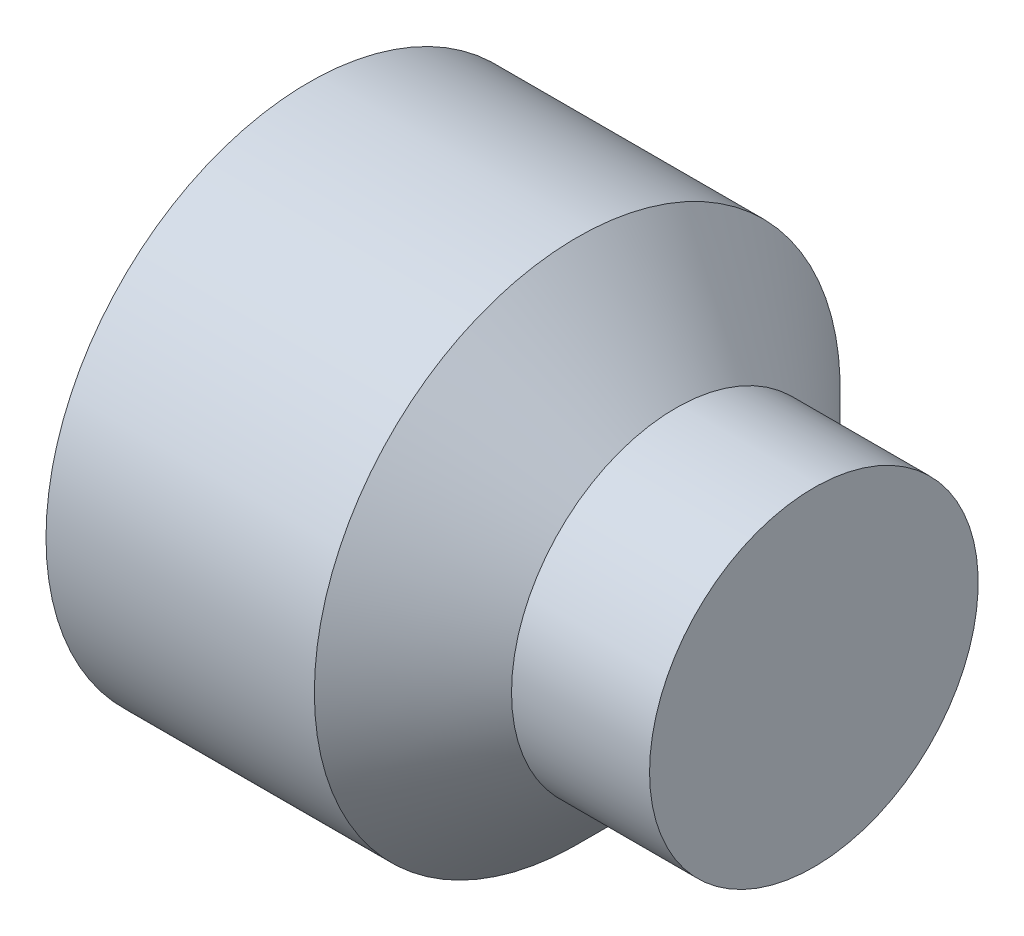
ISO-10303-21;
HEADER;
FILE_DESCRIPTION(('STEP AP214'),'2;1');
FILE_NAME('part.step','',(''),(''),'','','');
FILE_SCHEMA(('AUTOMOTIVE_DESIGN { 1 0 10303 214 1 1 1 1 }'));
ENDSEC;
DATA;
#1=APPLICATION_CONTEXT('core data for automotive mechanical design processes');
#2=APPLICATION_PROTOCOL_DEFINITION('international standard','automotive_design',2000,#1);
#3=PRODUCT_CONTEXT('',#1,'mechanical');
#4=PRODUCT('Part','Part','',(#3));
#5=PRODUCT_RELATED_PRODUCT_CATEGORY('part','',(#4));
#6=PRODUCT_DEFINITION_FORMATION('','',#4);
#7=PRODUCT_DEFINITION_CONTEXT('part definition',#1,'design');
#8=PRODUCT_DEFINITION('design','',#6,#7);
#9=PRODUCT_DEFINITION_SHAPE('','',#8);
#10=(LENGTH_UNIT() NAMED_UNIT(*) SI_UNIT(.MILLI.,.METRE.));
#11=(NAMED_UNIT(*) PLANE_ANGLE_UNIT() SI_UNIT($,.RADIAN.));
#12=(NAMED_UNIT(*) SI_UNIT($,.STERADIAN.) SOLID_ANGLE_UNIT());
#13=UNCERTAINTY_MEASURE_WITH_UNIT(LENGTH_MEASURE(1.E-05),#10,'distance_accuracy_value','');
#14=(GEOMETRIC_REPRESENTATION_CONTEXT(3) GLOBAL_UNCERTAINTY_ASSIGNED_CONTEXT((#13)) GLOBAL_UNIT_ASSIGNED_CONTEXT((#10,
#11,#12)) REPRESENTATION_CONTEXT('',''));
#15=CARTESIAN_POINT('',(0.,0.,0.));
#16=DIRECTION('',(0.,0.,1.));
#17=DIRECTION('',(1.,0.,0.));
#18=AXIS2_PLACEMENT_3D('',#15,#16,#17);
#19=CARTESIAN_POINT('',(2.5,-1.,0.577350269189625));
#20=DIRECTION('',(0.,-0.499999999999999,0.866025403784439));
#21=DIRECTION('',(0.,-0.866025403784439,-0.499999999999999));
#22=AXIS2_PLACEMENT_3D('',#19,#20,#21);
#23=PLANE('',#22);
#24=DIRECTION('',(1.,0.,0.));
#25=VECTOR('',#24,1.);
#26=CARTESIAN_POINT('',(2.5,0.,1.15470053837925));
#27=LINE('',#26,#25);
#28=CARTESIAN_POINT('',(2.5,0.,1.15470053837925));
#29=VERTEX_POINT('',#28);
#30=CARTESIAN_POINT('',(0.,0.,1.15470053837925));
#31=VERTEX_POINT('',#30);
#32=EDGE_CURVE('E84',#29,#31,#27,.F.);
#33=ORIENTED_EDGE('',*,*,#32,.F.);
#34=DIRECTION('',(0.,-0.866025403784439,-0.499999999999999));
#35=VECTOR('',#34,1.);
#36=CARTESIAN_POINT('',(2.5,-1.,0.577350269189625));
#37=LINE('',#36,#35);
#38=CARTESIAN_POINT('',(2.5,-1.,0.577350269189625));
#39=VERTEX_POINT('',#38);
#40=EDGE_CURVE('E66',#39,#29,#37,.F.);
#41=ORIENTED_EDGE('',*,*,#40,.F.);
#42=DIRECTION('',(1.,0.,0.));
#43=VECTOR('',#42,1.);
#44=CARTESIAN_POINT('',(2.5,-1.,0.577350269189625));
#45=LINE('',#44,#43);
#46=CARTESIAN_POINT('',(0.,-1.,0.577350269189625));
#47=VERTEX_POINT('',#46);
#48=EDGE_CURVE('E87',#47,#39,#45,.T.);
#49=ORIENTED_EDGE('',*,*,#48,.F.);
#50=DIRECTION('',(0.,-0.866025403784439,-0.499999999999999));
#51=VECTOR('',#50,1.);
#52=CARTESIAN_POINT('',(0.,-1.,0.577350269189625));
#53=LINE('',#52,#51);
#54=EDGE_CURVE('E74',#31,#47,#53,.T.);
#55=ORIENTED_EDGE('',*,*,#54,.F.);
#56=EDGE_LOOP('',(#33,#41,#49,#55));
#57=FACE_BOUND('',#56,.T.);
#58=ADVANCED_FACE('F17',(#57),#23,.F.);
#59=CARTESIAN_POINT('',(2.5,1.,0.577350269189625));
#60=DIRECTION('',(0.,-0.499999999999999,-0.866025403784439));
#61=DIRECTION('',(0.,0.866025403784439,-0.499999999999999));
#62=AXIS2_PLACEMENT_3D('',#59,#60,#61);
#63=PLANE('',#62);
#64=DIRECTION('',(0.,0.866025403784439,-0.499999999999999));
#65=VECTOR('',#64,1.);
#66=CARTESIAN_POINT('',(2.5,1.,0.577350269189625));
#67=LINE('',#66,#65);
#68=CARTESIAN_POINT('',(2.5,1.,0.577350269189625));
#69=VERTEX_POINT('',#68);
#70=EDGE_CURVE('E81',#69,#29,#67,.F.);
#71=ORIENTED_EDGE('',*,*,#70,.T.);
#72=ORIENTED_EDGE('',*,*,#32,.T.);
#73=DIRECTION('',(0.,0.866025403784439,-0.499999999999999));
#74=VECTOR('',#73,1.);
#75=CARTESIAN_POINT('',(0.,1.,0.577350269189625));
#76=LINE('',#75,#74);
#77=CARTESIAN_POINT('',(0.,1.,0.577350269189625));
#78=VERTEX_POINT('',#77);
#79=EDGE_CURVE('E70',#31,#78,#76,.T.);
#80=ORIENTED_EDGE('',*,*,#79,.T.);
#81=DIRECTION('',(1.,0.,0.));
#82=VECTOR('',#81,1.);
#83=CARTESIAN_POINT('',(2.5,1.,0.577350269189625));
#84=LINE('',#83,#82);
#85=EDGE_CURVE('E130',#78,#69,#84,.T.);
#86=ORIENTED_EDGE('',*,*,#85,.T.);
#87=EDGE_LOOP('',(#71,#72,#80,#86));
#88=FACE_BOUND('',#87,.T.);
#89=ADVANCED_FACE('F90',(#88),#63,.T.);
#90=CARTESIAN_POINT('',(2.5,-1.,0.577350269189625));
#91=DIRECTION('',(0.,1.,0.));
#92=DIRECTION('',(0.,0.,1.));
#93=AXIS2_PLACEMENT_3D('',#90,#91,#92);
#94=PLANE('',#93);
#95=DIRECTION('',(0.,0.,-1.));
#96=VECTOR('',#95,1.);
#97=CARTESIAN_POINT('',(2.5,-1.,1.73205080756888));
#98=LINE('',#97,#96);
#99=CARTESIAN_POINT('',(2.5,-1.,-0.577350269189626));
#100=VERTEX_POINT('',#99);
#101=EDGE_CURVE('E127',#39,#100,#98,.T.);
#102=ORIENTED_EDGE('',*,*,#101,.T.);
#103=DIRECTION('',(1.,0.,0.));
#104=VECTOR('',#103,1.);
#105=CARTESIAN_POINT('',(2.5,-1.,-0.577350269189626));
#106=LINE('',#105,#104);
#107=CARTESIAN_POINT('',(0.,-1.,-0.577350269189626));
#108=VERTEX_POINT('',#107);
#109=EDGE_CURVE('E120',#108,#100,#106,.T.);
#110=ORIENTED_EDGE('',*,*,#109,.F.);
#111=DIRECTION('',(0.,0.,1.));
#112=VECTOR('',#111,1.);
#113=CARTESIAN_POINT('',(0.,-1.,0.577350269189625));
#114=LINE('',#113,#112);
#115=EDGE_CURVE('E91',#108,#47,#114,.T.);
#116=ORIENTED_EDGE('',*,*,#115,.T.);
#117=ORIENTED_EDGE('',*,*,#48,.T.);
#118=EDGE_LOOP('',(#102,#110,#116,#117));
#119=FACE_BOUND('',#118,.T.);
#120=ADVANCED_FACE('F132',(#119),#94,.T.);
#121=CARTESIAN_POINT('',(2.5,1.,0.577350269189625));
#122=DIRECTION('',(0.,1.,0.));
#123=DIRECTION('',(0.,0.,1.));
#124=AXIS2_PLACEMENT_3D('',#121,#122,#123);
#125=PLANE('',#124);
#126=DIRECTION('',(1.,0.,0.));
#127=VECTOR('',#126,1.);
#128=CARTESIAN_POINT('',(2.5,1.,-0.577350269189626));
#129=LINE('',#128,#127);
#130=CARTESIAN_POINT('',(0.,1.,-0.577350269189626));
#131=VERTEX_POINT('',#130);
#132=CARTESIAN_POINT('',(2.5,1.,-0.577350269189626));
#133=VERTEX_POINT('',#132);
#134=EDGE_CURVE('E115',#131,#133,#129,.T.);
#135=ORIENTED_EDGE('',*,*,#134,.T.);
#136=DIRECTION('',(0.,0.,-1.));
#137=VECTOR('',#136,1.);
#138=CARTESIAN_POINT('',(2.5,1.,1.73205080756888));
#139=LINE('',#138,#137);
#140=EDGE_CURVE('E124',#133,#69,#139,.F.);
#141=ORIENTED_EDGE('',*,*,#140,.T.);
#142=ORIENTED_EDGE('',*,*,#85,.F.);
#143=DIRECTION('',(0.,0.,1.));
#144=VECTOR('',#143,1.);
#145=CARTESIAN_POINT('',(0.,1.,0.577350269189625));
#146=LINE('',#145,#144);
#147=EDGE_CURVE('E76',#131,#78,#146,.T.);
#148=ORIENTED_EDGE('',*,*,#147,.F.);
#149=EDGE_LOOP('',(#135,#141,#142,#148));
#150=FACE_BOUND('',#149,.T.);
#151=ADVANCED_FACE('F146',(#150),#125,.F.);
#152=CARTESIAN_POINT('',(2.5,-1.,1.73205080756888));
#153=DIRECTION('',(1.,0.,0.));
#154=DIRECTION('',(0.,0.,-1.));
#155=AXIS2_PLACEMENT_3D('',#152,#153,#154);
#156=PLANE('',#155);
#157=ORIENTED_EDGE('',*,*,#140,.F.);
#158=DIRECTION('',(0.,0.866025403784439,0.5));
#159=VECTOR('',#158,1.);
#160=CARTESIAN_POINT('',(2.5,1.,-0.577350269189626));
#161=LINE('',#160,#159);
#162=CARTESIAN_POINT('',(2.5,0.,-1.15470053837925));
#163=VERTEX_POINT('',#162);
#164=EDGE_CURVE('E113',#133,#163,#161,.F.);
#165=ORIENTED_EDGE('',*,*,#164,.T.);
#166=DIRECTION('',(0.,-0.866025403784439,0.5));
#167=VECTOR('',#166,1.);
#168=CARTESIAN_POINT('',(2.5,-1.,-0.577350269189626));
#169=LINE('',#168,#167);
#170=EDGE_CURVE('E117',#100,#163,#169,.F.);
#171=ORIENTED_EDGE('',*,*,#170,.F.);
#172=ORIENTED_EDGE('',*,*,#101,.F.);
#173=ORIENTED_EDGE('',*,*,#40,.T.);
#174=ORIENTED_EDGE('',*,*,#70,.F.);
#175=EDGE_LOOP('',(#157,#165,#171,#172,#173,#174));
#176=FACE_BOUND('',#175,.T.);
#177=ADVANCED_FACE('F136',(#176),#156,.F.);
#178=CARTESIAN_POINT('',(2.5,-1.,-0.577350269189626));
#179=DIRECTION('',(0.,0.5,0.866025403784439));
#180=DIRECTION('',(0.,-0.866025403784439,0.5));
#181=AXIS2_PLACEMENT_3D('',#178,#179,#180);
#182=PLANE('',#181);
#183=ORIENTED_EDGE('',*,*,#170,.T.);
#184=DIRECTION('',(1.,0.,0.));
#185=VECTOR('',#184,1.);
#186=CARTESIAN_POINT('',(2.5,0.,-1.15470053837925));
#187=LINE('',#186,#185);
#188=CARTESIAN_POINT('',(0.,0.,-1.15470053837925));
#189=VERTEX_POINT('',#188);
#190=EDGE_CURVE('E111',#163,#189,#187,.F.);
#191=ORIENTED_EDGE('',*,*,#190,.T.);
#192=DIRECTION('',(0.,-0.866025403784439,0.5));
#193=VECTOR('',#192,1.);
#194=CARTESIAN_POINT('',(0.,-1.,-0.577350269189626));
#195=LINE('',#194,#193);
#196=EDGE_CURVE('E35',#189,#108,#195,.T.);
#197=ORIENTED_EDGE('',*,*,#196,.T.);
#198=ORIENTED_EDGE('',*,*,#109,.T.);
#199=EDGE_LOOP('',(#183,#191,#197,#198));
#200=FACE_BOUND('',#199,.T.);
#201=ADVANCED_FACE('F140',(#200),#182,.T.);
#202=CARTESIAN_POINT('',(4.,1.25,0.));
#203=DIRECTION('',(1.,0.,0.));
#204=DIRECTION('',(0.,0.,-1.));
#205=AXIS2_PLACEMENT_3D('',#202,#203,#204);
#206=PLANE('',#205);
#207=CARTESIAN_POINT('',(4.,0.,0.));
#208=DIRECTION('',(-1.,0.,0.));
#209=DIRECTION('',(0.,0.,1.));
#210=AXIS2_PLACEMENT_3D('',#207,#208,#209);
#211=CIRCLE('',#210,1.25);
#212=CARTESIAN_POINT('',(4.,0.,1.25));
#213=VERTEX_POINT('',#212);
#214=EDGE_CURVE('E20',#213,#213,#211,.T.);
#215=ORIENTED_EDGE('',*,*,#214,.F.);
#216=EDGE_LOOP('',(#215));
#217=FACE_BOUND('',#216,.T.);
#218=ADVANCED_FACE('F180',(#217),#206,.T.);
#219=CARTESIAN_POINT('',(2.5,1.,-0.577350269189626));
#220=DIRECTION('',(0.,0.5,-0.866025403784439));
#221=DIRECTION('',(0.,0.866025403784439,0.5));
#222=AXIS2_PLACEMENT_3D('',#219,#220,#221);
#223=PLANE('',#222);
#224=ORIENTED_EDGE('',*,*,#190,.F.);
#225=ORIENTED_EDGE('',*,*,#164,.F.);
#226=ORIENTED_EDGE('',*,*,#134,.F.);
#227=DIRECTION('',(0.,0.866025403784438,0.5));
#228=VECTOR('',#227,1.);
#229=CARTESIAN_POINT('',(0.,0.,-1.15470053837925));
#230=LINE('',#229,#228);
#231=EDGE_CURVE('E105',#189,#131,#230,.T.);
#232=ORIENTED_EDGE('',*,*,#231,.F.);
#233=EDGE_LOOP('',(#224,#225,#226,#232));
#234=FACE_BOUND('',#233,.T.);
#235=ADVANCED_FACE('F144',(#234),#223,.F.);
#236=CARTESIAN_POINT('',(-12.7,0.,0.));
#237=DIRECTION('',(-1.,0.,0.));
#238=DIRECTION('',(0.,0.,1.));
#239=AXIS2_PLACEMENT_3D('',#236,#237,#238);
#240=CYLINDRICAL_SURFACE('',#239,1.25);
#241=CARTESIAN_POINT('',(2.94999999994161,0.,0.));
#242=DIRECTION('',(-1.,0.,0.));
#243=DIRECTION('',(0.,0.,1.));
#244=AXIS2_PLACEMENT_3D('',#241,#242,#243);
#245=CIRCLE('',#244,1.24999999997044);
#246=CARTESIAN_POINT('',(2.94999999994161,0.,1.24999999997044));
#247=VERTEX_POINT('',#246);
#248=EDGE_CURVE('E99',#247,#247,#245,.T.);
#249=ORIENTED_EDGE('',*,*,#248,.F.);
#250=EDGE_LOOP('',(#249));
#251=FACE_BOUND('',#250,.T.);
#252=ORIENTED_EDGE('',*,*,#214,.T.);
#253=EDGE_LOOP('',(#252));
#254=FACE_BOUND('',#253,.T.);
#255=ADVANCED_FACE('F174',(#251,#254),#240,.T.);
#256=CARTESIAN_POINT('',(0.,0.,0.));
#257=DIRECTION('',(-1.,0.,0.));
#258=DIRECTION('',(0.,0.,1.));
#259=AXIS2_PLACEMENT_3D('',#256,#257,#258);
#260=PLANE('',#259);
#261=ORIENTED_EDGE('',*,*,#196,.F.);
#262=ORIENTED_EDGE('',*,*,#231,.T.);
#263=ORIENTED_EDGE('',*,*,#147,.T.);
#264=ORIENTED_EDGE('',*,*,#79,.F.);
#265=ORIENTED_EDGE('',*,*,#54,.T.);
#266=ORIENTED_EDGE('',*,*,#115,.F.);
#267=EDGE_LOOP('',(#261,#262,#263,#264,#265,#266));
#268=FACE_BOUND('',#267,.T.);
#269=CARTESIAN_POINT('',(-5.68433917557537E-11,0.,0.));
#270=DIRECTION('',(1.,0.,0.));
#271=DIRECTION('',(0.,0.,-1.));
#272=AXIS2_PLACEMENT_3D('',#269,#270,#271);
#273=CIRCLE('',#272,1.72533333329739);
#274=CARTESIAN_POINT('',(-5.68433917557537E-11,0.,-1.72533333329739));
#275=VERTEX_POINT('',#274);
#276=EDGE_CURVE('E97',#275,#275,#273,.T.);
#277=ORIENTED_EDGE('',*,*,#276,.F.);
#278=EDGE_LOOP('',(#277));
#279=FACE_BOUND('',#278,.T.);
#280=ADVANCED_FACE('F72',(#268,#279),#260,.T.);
#281=CARTESIAN_POINT('',(2.19999999995935,0.,0.));
#282=DIRECTION('',(-1.,0.,0.));
#283=DIRECTION('',(0.,0.,1.));
#284=AXIS2_PLACEMENT_3D('',#281,#282,#283);
#285=CONICAL_SURFACE('',#284,2.00000000000955,0.785398163435344);
#286=CARTESIAN_POINT('',(2.2,0.,0.));
#287=DIRECTION('',(-1.,0.,0.));
#288=DIRECTION('',(0.,0.,1.));
#289=AXIS2_PLACEMENT_3D('',#286,#287,#288);
#290=CIRCLE('',#289,2.);
#291=CARTESIAN_POINT('',(2.2,0.,2.));
#292=VERTEX_POINT('',#291);
#293=EDGE_CURVE('E26',#292,#292,#290,.T.);
#294=ORIENTED_EDGE('',*,*,#293,.F.);
#295=EDGE_LOOP('',(#294));
#296=FACE_BOUND('',#295,.T.);
#297=ORIENTED_EDGE('',*,*,#248,.T.);
#298=EDGE_LOOP('',(#297));
#299=FACE_BOUND('',#298,.T.);
#300=ADVANCED_FACE('F164',(#296,#299),#285,.T.);
#301=CARTESIAN_POINT('',(0.158578873936221,0.,0.));
#302=DIRECTION('',(1.,0.,0.));
#303=DIRECTION('',(0.,0.,-1.));
#304=AXIS2_PLACEMENT_3D('',#301,#302,#303);
#305=CONICAL_SURFACE('',#304,2.00000000006639,1.04719755120599);
#306=CARTESIAN_POINT('',(0.158578873937415,0.,0.));
#307=DIRECTION('',(-1.,0.,0.));
#308=DIRECTION('',(0.,0.,1.));
#309=AXIS2_PLACEMENT_3D('',#306,#307,#308);
#310=CIRCLE('',#309,2.);
#311=CARTESIAN_POINT('',(0.158578873937415,0.,2.));
#312=VERTEX_POINT('',#311);
#313=EDGE_CURVE('E11',#312,#312,#310,.F.);
#314=ORIENTED_EDGE('',*,*,#313,.F.);
#315=EDGE_LOOP('',(#314));
#316=FACE_BOUND('',#315,.T.);
#317=ORIENTED_EDGE('',*,*,#276,.T.);
#318=EDGE_LOOP('',(#317));
#319=FACE_BOUND('',#318,.T.);
#320=ADVANCED_FACE('F158',(#316,#319),#305,.T.);
#321=CARTESIAN_POINT('',(-12.7,0.,0.));
#322=DIRECTION('',(-1.,0.,0.));
#323=DIRECTION('',(0.,0.,1.));
#324=AXIS2_PLACEMENT_3D('',#321,#322,#323);
#325=CYLINDRICAL_SURFACE('',#324,2.);
#326=ORIENTED_EDGE('',*,*,#313,.T.);
#327=EDGE_LOOP('',(#326));
#328=FACE_BOUND('',#327,.T.);
#329=ORIENTED_EDGE('',*,*,#293,.T.);
#330=EDGE_LOOP('',(#329));
#331=FACE_BOUND('',#330,.T.);
#332=ADVANCED_FACE('F156',(#328,#331),#325,.T.);
#333=CLOSED_SHELL('',(#58,#89,#120,#151,#177,#201,#218,#235,#255,#280,#300,#320,#332));
#334=MANIFOLD_SOLID_BREP('B1',#333);
#335=ADVANCED_BREP_SHAPE_REPRESENTATION('',(#18,#334),#14);
#336=SHAPE_DEFINITION_REPRESENTATION(#9,#335);
ENDSEC;
END-ISO-10303-21;
